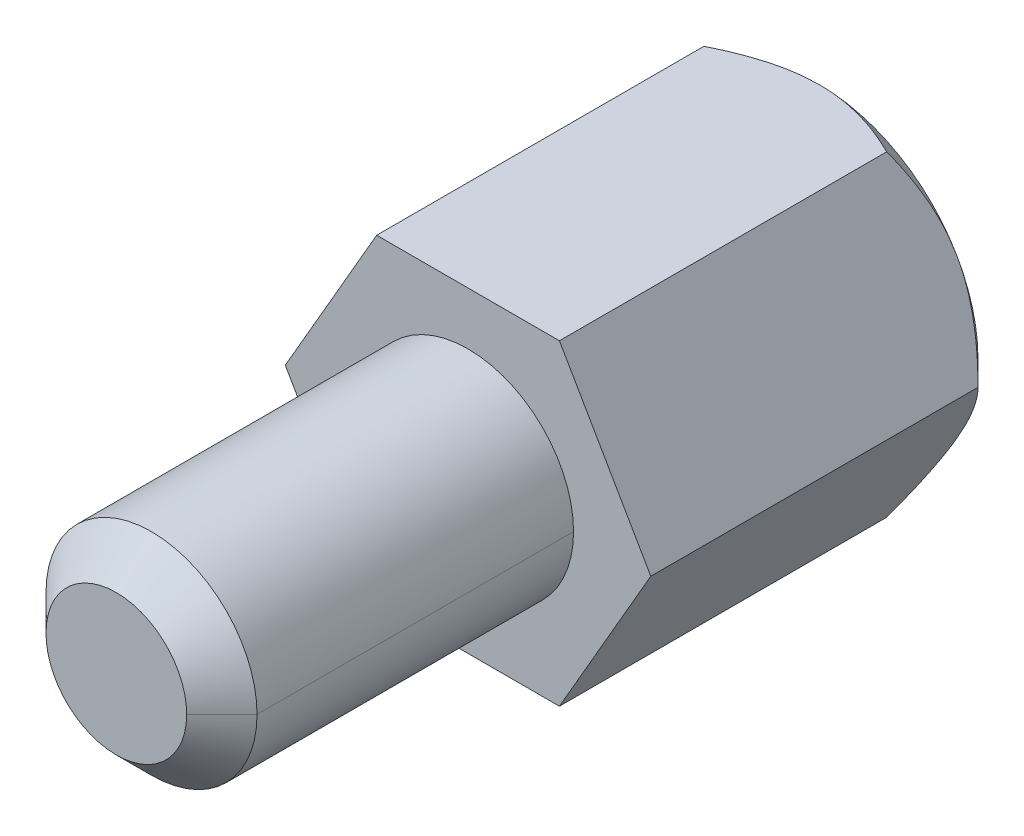
ISO-10303-21;
HEADER;
FILE_DESCRIPTION(('STEP AP214'),'2;1');
FILE_NAME('part.step','',(''),(''),'','','');
FILE_SCHEMA(('AUTOMOTIVE_DESIGN { 1 0 10303 214 1 1 1 1 }'));
ENDSEC;
DATA;
#1=APPLICATION_CONTEXT('core data for automotive mechanical design processes');
#2=APPLICATION_PROTOCOL_DEFINITION('international standard','automotive_design',2000,#1);
#3=PRODUCT_CONTEXT('',#1,'mechanical');
#4=PRODUCT('Part','Part','',(#3));
#5=PRODUCT_RELATED_PRODUCT_CATEGORY('part','',(#4));
#6=PRODUCT_DEFINITION_FORMATION('','',#4);
#7=PRODUCT_DEFINITION_CONTEXT('part definition',#1,'design');
#8=PRODUCT_DEFINITION('design','',#6,#7);
#9=PRODUCT_DEFINITION_SHAPE('','',#8);
#10=(LENGTH_UNIT() NAMED_UNIT(*) SI_UNIT(.MILLI.,.METRE.));
#11=(NAMED_UNIT(*) PLANE_ANGLE_UNIT() SI_UNIT($,.RADIAN.));
#12=(NAMED_UNIT(*) SI_UNIT($,.STERADIAN.) SOLID_ANGLE_UNIT());
#13=UNCERTAINTY_MEASURE_WITH_UNIT(LENGTH_MEASURE(1.E-05),#10,'distance_accuracy_value','');
#14=(GEOMETRIC_REPRESENTATION_CONTEXT(3) GLOBAL_UNCERTAINTY_ASSIGNED_CONTEXT((#13)) GLOBAL_UNIT_ASSIGNED_CONTEXT((#10,
#11,#12)) REPRESENTATION_CONTEXT('',''));
#15=CARTESIAN_POINT('',(0.,0.,0.));
#16=DIRECTION('',(0.,0.,1.));
#17=DIRECTION('',(1.,0.,0.));
#18=AXIS2_PLACEMENT_3D('',#15,#16,#17);
#19=CARTESIAN_POINT('',(0.,0.,-4.5));
#20=DIRECTION('',(0.,0.,-1.));
#21=DIRECTION('',(-1.,0.,0.));
#22=AXIS2_PLACEMENT_3D('',#19,#20,#21);
#23=CONICAL_SURFACE('',#22,1.2,0.78539816339745);
#24=CARTESIAN_POINT('',(0.,0.,-4.5));
#25=DIRECTION('',(0.,0.,-1.));
#26=DIRECTION('',(1.,0.,0.));
#27=AXIS2_PLACEMENT_3D('',#24,#25,#26);
#28=CIRCLE('',#27,1.2);
#29=CARTESIAN_POINT('',(1.2,0.,-4.5));
#30=VERTEX_POINT('',#29);
#31=CARTESIAN_POINT('',(-1.2,0.,-4.5));
#32=VERTEX_POINT('',#31);
#33=EDGE_CURVE('E43',#30,#32,#28,.T.);
#34=ORIENTED_EDGE('',*,*,#33,.F.);
#35=DIRECTION('',(0.707106781186549,0.,-0.707106781186546));
#36=VECTOR('',#35,1.);
#37=CARTESIAN_POINT('',(1.2,0.,-4.5));
#38=LINE('',#37,#36);
#39=CARTESIAN_POINT('',(1.7,0.,-5.));
#40=VERTEX_POINT('',#39);
#41=EDGE_CURVE('E11',#30,#40,#38,.T.);
#42=ORIENTED_EDGE('',*,*,#41,.T.);
#43=CARTESIAN_POINT('',(0.,0.,-5.));
#44=DIRECTION('',(0.,0.,1.));
#45=DIRECTION('',(1.,0.,0.));
#46=AXIS2_PLACEMENT_3D('',#43,#44,#45);
#47=CIRCLE('',#46,1.7);
#48=CARTESIAN_POINT('',(-1.7,0.,-5.));
#49=VERTEX_POINT('',#48);
#50=EDGE_CURVE('E427',#49,#40,#47,.T.);
#51=ORIENTED_EDGE('',*,*,#50,.F.);
#52=DIRECTION('',(-0.707106781186549,0.,-0.707106781186546));
#53=VECTOR('',#52,1.);
#54=CARTESIAN_POINT('',(-1.2,0.,-4.5));
#55=LINE('',#54,#53);
#56=EDGE_CURVE('E437',#32,#49,#55,.T.);
#57=ORIENTED_EDGE('',*,*,#56,.F.);
#58=EDGE_LOOP('',(#34,#42,#51,#57));
#59=FACE_BOUND('',#58,.T.);
#60=ADVANCED_FACE('F16',(#59),#23,.F.);
#61=CARTESIAN_POINT('',(0.,0.,-1.));
#62=DIRECTION('',(0.,0.,-1.));
#63=DIRECTION('',(-1.,0.,0.));
#64=AXIS2_PLACEMENT_3D('',#61,#62,#63);
#65=CYLINDRICAL_SURFACE('',#64,1.2);
#66=CARTESIAN_POINT('',(0.,0.,-1.));
#67=DIRECTION('',(0.,0.,-1.));
#68=DIRECTION('',(-1.,0.,0.));
#69=AXIS2_PLACEMENT_3D('',#66,#67,#68);
#70=CIRCLE('',#69,1.2);
#71=CARTESIAN_POINT('',(1.2,0.,-1.));
#72=VERTEX_POINT('',#71);
#73=CARTESIAN_POINT('',(-1.2,0.,-1.));
#74=VERTEX_POINT('',#73);
#75=EDGE_CURVE('E490',#72,#74,#70,.T.);
#76=ORIENTED_EDGE('',*,*,#75,.F.);
#77=DIRECTION('',(0.,0.,-1.));
#78=VECTOR('',#77,1.);
#79=CARTESIAN_POINT('',(1.2,0.,-1.));
#80=LINE('',#79,#78);
#81=EDGE_CURVE('E29',#72,#30,#80,.T.);
#82=ORIENTED_EDGE('',*,*,#81,.T.);
#83=ORIENTED_EDGE('',*,*,#33,.T.);
#84=DIRECTION('',(0.,0.,-1.));
#85=VECTOR('',#84,1.);
#86=CARTESIAN_POINT('',(-1.2,0.,-1.));
#87=LINE('',#86,#85);
#88=EDGE_CURVE('E484',#74,#32,#87,.T.);
#89=ORIENTED_EDGE('',*,*,#88,.F.);
#90=EDGE_LOOP('',(#76,#82,#83,#89));
#91=FACE_BOUND('',#90,.T.);
#92=ADVANCED_FACE('F18',(#91),#65,.F.);
#93=CARTESIAN_POINT('',(0.,0.,-3.9395963451307));
#94=DIRECTION('',(0.,0.,1.));
#95=DIRECTION('',(1.,0.,0.));
#96=AXIS2_PLACEMENT_3D('',#93,#94,#95);
#97=CONICAL_SURFACE('',#96,3.3104036548693,0.785398163397443);
#98=CARTESIAN_POINT('',(0.,0.,-5.));
#99=DIRECTION('',(0.,0.,-1.));
#100=DIRECTION('',(1.,0.,0.));
#101=AXIS2_PLACEMENT_3D('',#98,#99,#100);
#102=CIRCLE('',#101,2.25);
#103=CARTESIAN_POINT('',(2.25,0.,-5.));
#104=VERTEX_POINT('',#103);
#105=CARTESIAN_POINT('',(1.948557158515,-1.125,-5.));
#106=VERTEX_POINT('',#105);
#107=EDGE_CURVE('E625',#104,#106,#102,.T.);
#108=ORIENTED_EDGE('',*,*,#107,.F.);
#109=DIRECTION('',(0.707106781186544,0.,0.707106781186552));
#110=VECTOR('',#109,1.);
#111=CARTESIAN_POINT('',(3.3104036548693,0.,-3.9395963451307));
#112=LINE('',#111,#110);
#113=CARTESIAN_POINT('',(2.59807621135333,0.,-4.65192378864669));
#114=VERTEX_POINT('',#113);
#115=EDGE_CURVE('E454',#104,#114,#112,.T.);
#116=ORIENTED_EDGE('',*,*,#115,.T.);
#117=CARTESIAN_POINT('',(1.94855715851499,-1.125,-5.));
#118=CARTESIAN_POINT('',(2.11169365571798,-0.842439298275589,-5.));
#119=CARTESIAN_POINT('',(2.28210688404402,-0.547274928533067,-4.90318904093193));
#120=CARTESIAN_POINT('',(2.43191789424751,-0.287794647327387,-4.81808210575311));
#121=CARTESIAN_POINT('',(2.59807621135332,0.,-4.65192378864668));
#122=B_SPLINE_CURVE_WITH_KNOTS('',2,(#117,#118,#119,#120,#121),.UNSPECIFIED.,.F.,.F.,(3,2,3),
(0.,0.5,1.),.UNSPECIFIED.);
#123=EDGE_CURVE('E648',#106,#114,#122,.T.);
#124=ORIENTED_EDGE('',*,*,#123,.F.);
#125=EDGE_LOOP('',(#108,#116,#124));
#126=FACE_BOUND('',#125,.T.);
#127=ADVANCED_FACE('F387',(#126),#97,.T.);
#128=CARTESIAN_POINT('',(0.,0.,5.));
#129=DIRECTION('',(0.,0.,-1.));
#130=DIRECTION('',(-1.,0.,0.));
#131=AXIS2_PLACEMENT_3D('',#128,#129,#130);
#132=CONICAL_SURFACE('',#131,1.,0.785398163397446);
#133=CARTESIAN_POINT('',(0.,0.,5.));
#134=DIRECTION('',(0.,0.,1.));
#135=DIRECTION('',(1.,0.,0.));
#136=AXIS2_PLACEMENT_3D('',#133,#134,#135);
#137=CIRCLE('',#136,1.);
#138=CARTESIAN_POINT('',(1.,0.,5.));
#139=VERTEX_POINT('',#138);
#140=CARTESIAN_POINT('',(-1.,0.,5.));
#141=VERTEX_POINT('',#140);
#142=EDGE_CURVE('E267',#139,#141,#137,.T.);
#143=ORIENTED_EDGE('',*,*,#142,.F.);
#144=DIRECTION('',(0.707106781186546,0.,-0.707106781186549));
#145=VECTOR('',#144,1.);
#146=CARTESIAN_POINT('',(1.,0.,5.));
#147=LINE('',#146,#145);
#148=CARTESIAN_POINT('',(1.5,0.,4.5));
#149=VERTEX_POINT('',#148);
#150=EDGE_CURVE('E450',#139,#149,#147,.T.);
#151=ORIENTED_EDGE('',*,*,#150,.T.);
#152=CARTESIAN_POINT('',(0.,0.,4.5));
#153=DIRECTION('',(0.,0.,-1.));
#154=DIRECTION('',(1.,0.,0.));
#155=AXIS2_PLACEMENT_3D('',#152,#153,#154);
#156=CIRCLE('',#155,1.5);
#157=CARTESIAN_POINT('',(-1.5,0.,4.5));
#158=VERTEX_POINT('',#157);
#159=EDGE_CURVE('E455',#158,#149,#156,.T.);
#160=ORIENTED_EDGE('',*,*,#159,.F.);
#161=DIRECTION('',(-0.707106781186546,0.,-0.707106781186549));
#162=VECTOR('',#161,1.);
#163=CARTESIAN_POINT('',(-1.,0.,5.));
#164=LINE('',#163,#162);
#165=EDGE_CURVE('E261',#141,#158,#164,.T.);
#166=ORIENTED_EDGE('',*,*,#165,.F.);
#167=EDGE_LOOP('',(#143,#151,#160,#166));
#168=FACE_BOUND('',#167,.T.);
#169=ADVANCED_FACE('F397',(#168),#132,.T.);
#170=CARTESIAN_POINT('',(0.,0.,5.));
#171=DIRECTION('',(0.,0.,-1.));
#172=DIRECTION('',(-1.,0.,0.));
#173=AXIS2_PLACEMENT_3D('',#170,#171,#172);
#174=CYLINDRICAL_SURFACE('',#173,1.5);
#175=ORIENTED_EDGE('',*,*,#159,.T.);
#176=DIRECTION('',(0.,0.,-1.));
#177=VECTOR('',#176,1.);
#178=CARTESIAN_POINT('',(1.5,0.,5.));
#179=LINE('',#178,#177);
#180=CARTESIAN_POINT('',(1.5,0.,0.));
#181=VERTEX_POINT('',#180);
#182=EDGE_CURVE('E460',#149,#181,#179,.T.);
#183=ORIENTED_EDGE('',*,*,#182,.T.);
#184=CARTESIAN_POINT('',(0.,0.,0.));
#185=DIRECTION('',(0.,0.,1.));
#186=DIRECTION('',(1.,0.,0.));
#187=AXIS2_PLACEMENT_3D('',#184,#185,#186);
#188=CIRCLE('',#187,1.5);
#189=CARTESIAN_POINT('',(-1.5,0.,0.));
#190=VERTEX_POINT('',#189);
#191=EDGE_CURVE('E464',#181,#190,#188,.T.);
#192=ORIENTED_EDGE('',*,*,#191,.T.);
#193=DIRECTION('',(0.,0.,-1.));
#194=VECTOR('',#193,1.);
#195=CARTESIAN_POINT('',(-1.5,0.,5.));
#196=LINE('',#195,#194);
#197=EDGE_CURVE('E497',#158,#190,#196,.T.);
#198=ORIENTED_EDGE('',*,*,#197,.F.);
#199=EDGE_LOOP('',(#175,#183,#192,#198));
#200=FACE_BOUND('',#199,.T.);
#201=ADVANCED_FACE('F244',(#200),#174,.T.);
#202=CARTESIAN_POINT('',(0.,0.,5.));
#203=DIRECTION('',(0.,0.,-1.));
#204=DIRECTION('',(-1.,0.,0.));
#205=AXIS2_PLACEMENT_3D('',#202,#203,#204);
#206=CYLINDRICAL_SURFACE('',#205,1.5);
#207=ORIENTED_EDGE('',*,*,#182,.F.);
#208=CARTESIAN_POINT('',(0.,0.,4.5));
#209=DIRECTION('',(0.,0.,-1.));
#210=DIRECTION('',(1.,0.,0.));
#211=AXIS2_PLACEMENT_3D('',#208,#209,#210);
#212=CIRCLE('',#211,1.5);
#213=EDGE_CURVE('E444',#149,#158,#212,.T.);
#214=ORIENTED_EDGE('',*,*,#213,.T.);
#215=ORIENTED_EDGE('',*,*,#197,.T.);
#216=CARTESIAN_POINT('',(0.,0.,0.));
#217=DIRECTION('',(0.,0.,1.));
#218=DIRECTION('',(1.,0.,0.));
#219=AXIS2_PLACEMENT_3D('',#216,#217,#218);
#220=CIRCLE('',#219,1.5);
#221=EDGE_CURVE('E459',#190,#181,#220,.T.);
#222=ORIENTED_EDGE('',*,*,#221,.T.);
#223=EDGE_LOOP('',(#207,#214,#215,#222));
#224=FACE_BOUND('',#223,.T.);
#225=ADVANCED_FACE('F402',(#224),#206,.T.);
#226=CARTESIAN_POINT('',(0.,0.,5.));
#227=DIRECTION('',(0.,0.,1.));
#228=DIRECTION('',(1.,0.,0.));
#229=AXIS2_PLACEMENT_3D('',#226,#227,#228);
#230=PLANE('',#229);
#231=CARTESIAN_POINT('',(0.,0.,5.));
#232=DIRECTION('',(0.,0.,1.));
#233=DIRECTION('',(1.,0.,0.));
#234=AXIS2_PLACEMENT_3D('',#231,#232,#233);
#235=CIRCLE('',#234,1.);
#236=EDGE_CURVE('E456',#141,#139,#235,.T.);
#237=ORIENTED_EDGE('',*,*,#236,.T.);
#238=ORIENTED_EDGE('',*,*,#142,.T.);
#239=EDGE_LOOP('',(#237,#238));
#240=FACE_BOUND('',#239,.T.);
#241=ADVANCED_FACE('F399',(#240),#230,.T.);
#242=CARTESIAN_POINT('',(0.,0.,5.));
#243=DIRECTION('',(0.,0.,-1.));
#244=DIRECTION('',(-1.,0.,0.));
#245=AXIS2_PLACEMENT_3D('',#242,#243,#244);
#246=CONICAL_SURFACE('',#245,1.,0.785398163397446);
#247=ORIENTED_EDGE('',*,*,#150,.F.);
#248=ORIENTED_EDGE('',*,*,#236,.F.);
#249=ORIENTED_EDGE('',*,*,#165,.T.);
#250=ORIENTED_EDGE('',*,*,#213,.F.);
#251=EDGE_LOOP('',(#247,#248,#249,#250));
#252=FACE_BOUND('',#251,.T.);
#253=ADVANCED_FACE('F302',(#252),#246,.T.);
#254=CARTESIAN_POINT('',(-1.29903810567666,-2.25,0.));
#255=DIRECTION('',(0.,0.,1.));
#256=DIRECTION('',(1.,0.,0.));
#257=AXIS2_PLACEMENT_3D('',#254,#255,#256);
#258=PLANE('',#257);
#259=DIRECTION('',(-0.5,0.866025403784439,0.));
#260=VECTOR('',#259,1.);
#261=CARTESIAN_POINT('',(-1.29903810567666,-2.25,0.));
#262=LINE('',#261,#260);
#263=CARTESIAN_POINT('',(-1.29903810567666,-2.25,0.));
#264=VERTEX_POINT('',#263);
#265=CARTESIAN_POINT('',(-2.59807621135332,0.,0.));
#266=VERTEX_POINT('',#265);
#267=EDGE_CURVE('E168',#264,#266,#262,.T.);
#268=ORIENTED_EDGE('',*,*,#267,.F.);
#269=DIRECTION('',(-1.,0.,0.));
#270=VECTOR('',#269,1.);
#271=CARTESIAN_POINT('',(1.29903810567666,-2.25,0.));
#272=LINE('',#271,#270);
#273=CARTESIAN_POINT('',(1.29903810567666,-2.25,0.));
#274=VERTEX_POINT('',#273);
#275=EDGE_CURVE('E471',#274,#264,#272,.T.);
#276=ORIENTED_EDGE('',*,*,#275,.F.);
#277=DIRECTION('',(-0.5,-0.866025403784439,0.));
#278=VECTOR('',#277,1.);
#279=CARTESIAN_POINT('',(2.59807621135332,0.,0.));
#280=LINE('',#279,#278);
#281=CARTESIAN_POINT('',(2.59807621135332,0.,0.));
#282=VERTEX_POINT('',#281);
#283=EDGE_CURVE('E446',#282,#274,#280,.T.);
#284=ORIENTED_EDGE('',*,*,#283,.F.);
#285=DIRECTION('',(0.5,-0.866025403784439,0.));
#286=VECTOR('',#285,1.);
#287=CARTESIAN_POINT('',(1.29903810567666,2.25,0.));
#288=LINE('',#287,#286);
#289=CARTESIAN_POINT('',(1.29903810567666,2.25,0.));
#290=VERTEX_POINT('',#289);
#291=EDGE_CURVE('E465',#290,#282,#288,.T.);
#292=ORIENTED_EDGE('',*,*,#291,.F.);
#293=DIRECTION('',(1.,0.,0.));
#294=VECTOR('',#293,1.);
#295=CARTESIAN_POINT('',(-1.29903810567665,2.25,0.));
#296=LINE('',#295,#294);
#297=CARTESIAN_POINT('',(-1.29903810567665,2.25,0.));
#298=VERTEX_POINT('',#297);
#299=EDGE_CURVE('E171',#298,#290,#296,.T.);
#300=ORIENTED_EDGE('',*,*,#299,.F.);
#301=DIRECTION('',(0.5,0.866025403784439,0.));
#302=VECTOR('',#301,1.);
#303=CARTESIAN_POINT('',(-2.59807621135332,0.,0.));
#304=LINE('',#303,#302);
#305=EDGE_CURVE('E164',#266,#298,#304,.T.);
#306=ORIENTED_EDGE('',*,*,#305,.F.);
#307=EDGE_LOOP('',(#268,#276,#284,#292,#300,#306));
#308=FACE_BOUND('',#307,.T.);
#309=ORIENTED_EDGE('',*,*,#221,.F.);
#310=ORIENTED_EDGE('',*,*,#191,.F.);
#311=EDGE_LOOP('',(#309,#310));
#312=FACE_BOUND('',#311,.T.);
#313=ADVANCED_FACE('F166',(#308,#312),#258,.T.);
#314=CARTESIAN_POINT('',(-1.29903810567665,-2.25,-5.));
#315=DIRECTION('',(0.866025403784439,0.5,0.));
#316=DIRECTION('',(0.,0.,-1.));
#317=AXIS2_PLACEMENT_3D('',#314,#315,#316);
#318=PLANE('',#317);
#319=DIRECTION('',(0.,0.,1.));
#320=VECTOR('',#319,1.);
#321=CARTESIAN_POINT('',(-2.59807621135332,0.,-5.));
#322=LINE('',#321,#320);
#323=CARTESIAN_POINT('',(-2.5980762113533,0.,-4.65192378864668));
#324=VERTEX_POINT('',#323);
#325=EDGE_CURVE('E176',#324,#266,#322,.T.);
#326=ORIENTED_EDGE('',*,*,#325,.F.);
#327=CARTESIAN_POINT('',(-2.59807621135331,0.,-4.65192378864668));
#328=CARTESIAN_POINT('',(-2.43332011776567,-0.285365924950353,-4.81667988223433));
#329=CARTESIAN_POINT('',(-2.28416109301223,-0.543716934230743,-4.90201788690797));
#330=CARTESIAN_POINT('',(-2.11290191618965,-0.840346529749865,-5.));
#331=CARTESIAN_POINT('',(-1.94855715851498,-1.125,-5.));
#332=B_SPLINE_CURVE_WITH_KNOTS('',2,(#327,#328,#329,#330,#331),.UNSPECIFIED.,.F.,.F.,(3,2,3),
(0.,0.5,1.),.UNSPECIFIED.);
#333=CARTESIAN_POINT('',(-1.94855715851499,-1.125,-5.));
#334=VERTEX_POINT('',#333);
#335=EDGE_CURVE('E257',#324,#334,#332,.T.);
#336=ORIENTED_EDGE('',*,*,#335,.T.);
#337=CARTESIAN_POINT('',(-1.94855715851498,-1.125,-5.));
#338=CARTESIAN_POINT('',(-1.78542066131107,-1.407560701726,-5.));
#339=CARTESIAN_POINT('',(-1.61500743298595,-1.70272507146693,-4.90318904093194));
#340=CARTESIAN_POINT('',(-1.4651964227814,-1.96220535267443,-4.81808210575207));
#341=CARTESIAN_POINT('',(-1.29903810567665,-2.25,-4.65192378864668));
#342=B_SPLINE_CURVE_WITH_KNOTS('',2,(#337,#338,#339,#340,#341),.UNSPECIFIED.,.F.,.F.,(3,2,3),
(0.,0.5,1.),.UNSPECIFIED.);
#343=CARTESIAN_POINT('',(-1.29903810567665,-2.25,-4.65192378864668));
#344=VERTEX_POINT('',#343);
#345=EDGE_CURVE('E225',#334,#344,#342,.T.);
#346=ORIENTED_EDGE('',*,*,#345,.T.);
#347=DIRECTION('',(0.,0.,1.));
#348=VECTOR('',#347,1.);
#349=CARTESIAN_POINT('',(-1.29903810567665,-2.25,-5.));
#350=LINE('',#349,#348);
#351=EDGE_CURVE('E184',#344,#264,#350,.T.);
#352=ORIENTED_EDGE('',*,*,#351,.T.);
#353=ORIENTED_EDGE('',*,*,#267,.T.);
#354=EDGE_LOOP('',(#326,#336,#346,#352,#353));
#355=FACE_BOUND('',#354,.T.);
#356=ADVANCED_FACE('F180',(#355),#318,.F.);
#357=CARTESIAN_POINT('',(-2.59807621135332,0.,-5.));
#358=DIRECTION('',(0.866025403784439,-0.5,0.));
#359=DIRECTION('',(0.,0.,-1.));
#360=AXIS2_PLACEMENT_3D('',#357,#358,#359);
#361=PLANE('',#360);
#362=DIRECTION('',(0.,0.,1.));
#363=VECTOR('',#362,1.);
#364=CARTESIAN_POINT('',(-1.29903810567665,2.25,-5.));
#365=LINE('',#364,#363);
#366=CARTESIAN_POINT('',(-1.29903810567665,2.25,-4.65192378864668));
#367=VERTEX_POINT('',#366);
#368=EDGE_CURVE('E504',#367,#298,#365,.T.);
#369=ORIENTED_EDGE('',*,*,#368,.F.);
#370=CARTESIAN_POINT('',(-1.29903810567666,2.25,-4.65192378864668));
#371=CARTESIAN_POINT('',(-1.46379419926481,1.96463407504874,-4.81667988223484));
#372=CARTESIAN_POINT('',(-1.61295322401773,1.70628306576926,-4.90201788690796));
#373=CARTESIAN_POINT('',(-1.78421240084075,1.40965347024936,-5.));
#374=CARTESIAN_POINT('',(-1.94855715851499,1.125,-5.));
#375=B_SPLINE_CURVE_WITH_KNOTS('',2,(#370,#371,#372,#373,#374),.UNSPECIFIED.,.F.,.F.,(3,2,3),
(0.,0.5,1.),.UNSPECIFIED.);
#376=CARTESIAN_POINT('',(-1.94855715851499,1.125,-5.));
#377=VERTEX_POINT('',#376);
#378=EDGE_CURVE('E186',#367,#377,#375,.T.);
#379=ORIENTED_EDGE('',*,*,#378,.T.);
#380=CARTESIAN_POINT('',(-1.94855715851499,1.125,-5.));
#381=CARTESIAN_POINT('',(-2.11169365571896,0.842439298273893,-5.));
#382=CARTESIAN_POINT('',(-2.28210688404401,0.547274928533074,-4.90318904093194));
#383=CARTESIAN_POINT('',(-2.43191789424865,0.287794647325415,-4.81808210575199));
#384=CARTESIAN_POINT('',(-2.59807621135331,0.,-4.65192378864668));
#385=B_SPLINE_CURVE_WITH_KNOTS('',2,(#380,#381,#382,#383,#384),.UNSPECIFIED.,.F.,.F.,(3,2,3),
(0.,0.5,1.),.UNSPECIFIED.);
#386=EDGE_CURVE('E192',#377,#324,#385,.T.);
#387=ORIENTED_EDGE('',*,*,#386,.T.);
#388=ORIENTED_EDGE('',*,*,#325,.T.);
#389=ORIENTED_EDGE('',*,*,#305,.T.);
#390=EDGE_LOOP('',(#369,#379,#387,#388,#389));
#391=FACE_BOUND('',#390,.T.);
#392=ADVANCED_FACE('F189',(#391),#361,.F.);
#393=CARTESIAN_POINT('',(-1.29903810567665,2.25,-5.));
#394=DIRECTION('',(0.,-1.,0.));
#395=DIRECTION('',(0.,0.,-1.));
#396=AXIS2_PLACEMENT_3D('',#393,#394,#395);
#397=PLANE('',#396);
#398=DIRECTION('',(0.,0.,1.));
#399=VECTOR('',#398,1.);
#400=CARTESIAN_POINT('',(1.29903810567666,2.25,-5.));
#401=LINE('',#400,#399);
#402=CARTESIAN_POINT('',(1.29903810567666,2.25,-4.65192378864669));
#403=VERTEX_POINT('',#402);
#404=EDGE_CURVE('E469',#403,#290,#401,.T.);
#405=ORIENTED_EDGE('',*,*,#404,.F.);
#406=CARTESIAN_POINT('',(1.29903810567667,2.25,-4.65192378864669));
#407=CARTESIAN_POINT('',(0.96806314563542,2.25,-4.81741126866729));
#408=CARTESIAN_POINT('',(0.66850190249739,2.25,-4.90278999796724));
#409=CARTESIAN_POINT('',(0.32742925720091,2.25,-5.));
#410=CARTESIAN_POINT('',(0.,2.25,-5.));
#411=B_SPLINE_CURVE_WITH_KNOTS('',2,(#406,#407,#408,#409,#410),.UNSPECIFIED.,.F.,.F.,(3,2,3),
(0.,0.5,1.),.UNSPECIFIED.);
#412=CARTESIAN_POINT('',(0.,2.25,-5.));
#413=VERTEX_POINT('',#412);
#414=EDGE_CURVE('E177',#403,#413,#411,.T.);
#415=ORIENTED_EDGE('',*,*,#414,.T.);
#416=CARTESIAN_POINT('',(0.,2.25,-5.));
#417=CARTESIAN_POINT('',(-0.327135265220307,2.25,-5.));
#418=CARTESIAN_POINT('',(-0.66893435586008,2.25,-4.90266679560614));
#419=CARTESIAN_POINT('',(-0.967721984934793,2.25,-4.81758184901763));
#420=CARTESIAN_POINT('',(-1.29903810567665,2.25,-4.65192378864668));
#421=B_SPLINE_CURVE_WITH_KNOTS('',2,(#416,#417,#418,#419,#420),.UNSPECIFIED.,.F.,.F.,(3,2,3),
(0.,0.5,1.),.UNSPECIFIED.);
#422=EDGE_CURVE('E511',#413,#367,#421,.T.);
#423=ORIENTED_EDGE('',*,*,#422,.T.);
#424=ORIENTED_EDGE('',*,*,#368,.T.);
#425=ORIENTED_EDGE('',*,*,#299,.T.);
#426=EDGE_LOOP('',(#405,#415,#423,#424,#425));
#427=FACE_BOUND('',#426,.T.);
#428=ADVANCED_FACE('F301',(#427),#397,.F.);
#429=CARTESIAN_POINT('',(1.29903810567666,2.25,-5.));
#430=DIRECTION('',(-0.866025403784439,-0.5,0.));
#431=DIRECTION('',(-0.5,0.866025403784439,0.));
#432=AXIS2_PLACEMENT_3D('',#429,#430,#431);
#433=PLANE('',#432);
#434=DIRECTION('',(0.,0.,1.));
#435=VECTOR('',#434,1.);
#436=CARTESIAN_POINT('',(2.59807621135332,0.,-5.));
#437=LINE('',#436,#435);
#438=EDGE_CURVE('E449',#114,#282,#437,.T.);
#439=ORIENTED_EDGE('',*,*,#438,.F.);
#440=CARTESIAN_POINT('',(2.59807621135332,0.,-4.65192378864668));
#441=CARTESIAN_POINT('',(2.43332011776683,0.285365924948369,-4.81667988223315));
#442=CARTESIAN_POINT('',(2.28416109301224,0.543716934230743,-4.90201788690795));
#443=CARTESIAN_POINT('',(2.11290191619064,0.840346529748177,-5.));
#444=CARTESIAN_POINT('',(1.94855715851499,1.125,-5.));
#445=B_SPLINE_CURVE_WITH_KNOTS('',2,(#440,#441,#442,#443,#444),.UNSPECIFIED.,.F.,.F.,(3,2,3),
(0.,0.5,1.),.UNSPECIFIED.);
#446=CARTESIAN_POINT('',(1.948557158515,1.125,-5.));
#447=VERTEX_POINT('',#446);
#448=EDGE_CURVE('E505',#114,#447,#445,.T.);
#449=ORIENTED_EDGE('',*,*,#448,.T.);
#450=CARTESIAN_POINT('',(1.94855715851499,1.125,-5.));
#451=CARTESIAN_POINT('',(1.78542066131202,1.40756070172436,-5.));
#452=CARTESIAN_POINT('',(1.61500743298597,1.70272507146693,-4.90318904093193));
#453=CARTESIAN_POINT('',(1.46519642278249,1.96220535267256,-4.81808210575313));
#454=CARTESIAN_POINT('',(1.29903810567666,2.25,-4.65192378864668));
#455=B_SPLINE_CURVE_WITH_KNOTS('',2,(#450,#451,#452,#453,#454),.UNSPECIFIED.,.F.,.F.,(3,2,3),
(0.,0.5,1.),.UNSPECIFIED.);
#456=EDGE_CURVE('E515',#447,#403,#455,.T.);
#457=ORIENTED_EDGE('',*,*,#456,.T.);
#458=ORIENTED_EDGE('',*,*,#404,.T.);
#459=ORIENTED_EDGE('',*,*,#291,.T.);
#460=EDGE_LOOP('',(#439,#449,#457,#458,#459));
#461=FACE_BOUND('',#460,.T.);
#462=ADVANCED_FACE('F565',(#461),#433,.F.);
#463=CARTESIAN_POINT('',(2.59807621135332,0.,-5.));
#464=DIRECTION('',(-0.866025403784439,0.5,0.));
#465=DIRECTION('',(0.,0.,1.));
#466=AXIS2_PLACEMENT_3D('',#463,#464,#465);
#467=PLANE('',#466);
#468=DIRECTION('',(0.,0.,1.));
#469=VECTOR('',#468,1.);
#470=CARTESIAN_POINT('',(1.29903810567666,-2.25,-5.));
#471=LINE('',#470,#469);
#472=CARTESIAN_POINT('',(1.29903810567666,-2.25,-4.65192378864669));
#473=VERTEX_POINT('',#472);
#474=EDGE_CURVE('E474',#473,#274,#471,.T.);
#475=ORIENTED_EDGE('',*,*,#474,.F.);
#476=CARTESIAN_POINT('',(1.29903810567666,-2.25,-4.65192378864668));
#477=CARTESIAN_POINT('',(1.46379419926432,-1.9646340750496,-4.81667988223433));
#478=CARTESIAN_POINT('',(1.61295322401774,-1.70628306576925,-4.90201788690796));
#479=CARTESIAN_POINT('',(1.78421240084034,-1.40965347025009,-5.));
#480=CARTESIAN_POINT('',(1.94855715851499,-1.125,-5.));
#481=B_SPLINE_CURVE_WITH_KNOTS('',2,(#476,#477,#478,#479,#480),.UNSPECIFIED.,.F.,.F.,(3,2,3),
(0.,0.5,1.),.UNSPECIFIED.);
#482=EDGE_CURVE('E470',#473,#106,#481,.T.);
#483=ORIENTED_EDGE('',*,*,#482,.T.);
#484=ORIENTED_EDGE('',*,*,#123,.T.);
#485=ORIENTED_EDGE('',*,*,#438,.T.);
#486=ORIENTED_EDGE('',*,*,#283,.T.);
#487=EDGE_LOOP('',(#475,#483,#484,#485,#486));
#488=FACE_BOUND('',#487,.T.);
#489=ADVANCED_FACE('F368',(#488),#467,.F.);
#490=CARTESIAN_POINT('',(1.29903810567666,-2.25,-5.));
#491=DIRECTION('',(0.,1.,0.));
#492=DIRECTION('',(1.,0.,0.));
#493=AXIS2_PLACEMENT_3D('',#490,#491,#492);
#494=PLANE('',#493);
#495=ORIENTED_EDGE('',*,*,#351,.F.);
#496=CARTESIAN_POINT('',(-1.29903810567665,-2.25,-4.65192378864667));
#497=CARTESIAN_POINT('',(-0.968298108522936,-2.25,-4.81729378722356));
#498=CARTESIAN_POINT('',(-0.668934355860116,-2.25,-4.90266679560612));
#499=CARTESIAN_POINT('',(-0.327631713747806,-2.25,-4.99999999999999));
#500=CARTESIAN_POINT('',(0.,-2.25,-4.99999999999999));
#501=B_SPLINE_CURVE_WITH_KNOTS('',2,(#496,#497,#498,#499,#500),.UNSPECIFIED.,.F.,.F.,(3,2,3),
(0.,0.5,1.),.UNSPECIFIED.);
#502=CARTESIAN_POINT('',(0.,-2.25,-5.));
#503=VERTEX_POINT('',#502);
#504=EDGE_CURVE('E379',#344,#503,#501,.T.);
#505=ORIENTED_EDGE('',*,*,#504,.T.);
#506=CARTESIAN_POINT('',(0.,-2.25,-4.99999999999999));
#507=CARTESIAN_POINT('',(0.326934914521115,-2.25,-4.99999999999999));
#508=CARTESIAN_POINT('',(0.668501902497399,-2.25,-4.90278999796723));
#509=CARTESIAN_POINT('',(0.967489483182874,-2.25,-4.81769809989357));
#510=CARTESIAN_POINT('',(1.29903810567666,-2.25,-4.65192378864668));
#511=B_SPLINE_CURVE_WITH_KNOTS('',2,(#506,#507,#508,#509,#510),.UNSPECIFIED.,.F.,.F.,(3,2,3),
(0.,0.5,1.),.UNSPECIFIED.);
#512=EDGE_CURVE('E357',#503,#473,#511,.T.);
#513=ORIENTED_EDGE('',*,*,#512,.T.);
#514=ORIENTED_EDGE('',*,*,#474,.T.);
#515=ORIENTED_EDGE('',*,*,#275,.T.);
#516=EDGE_LOOP('',(#495,#505,#513,#514,#515));
#517=FACE_BOUND('',#516,.T.);
#518=ADVANCED_FACE('F360',(#517),#494,.F.);
#519=CARTESIAN_POINT('',(0.,0.,-3.9395963451307));
#520=DIRECTION('',(0.,0.,1.));
#521=DIRECTION('',(1.,0.,0.));
#522=AXIS2_PLACEMENT_3D('',#519,#520,#521);
#523=CONICAL_SURFACE('',#522,3.3104036548693,0.785398163397443);
#524=ORIENTED_EDGE('',*,*,#115,.F.);
#525=CARTESIAN_POINT('',(0.,0.,-5.));
#526=DIRECTION('',(0.,0.,-1.));
#527=DIRECTION('',(1.,0.,0.));
#528=AXIS2_PLACEMENT_3D('',#525,#526,#527);
#529=CIRCLE('',#528,2.25);
#530=EDGE_CURVE('E425',#447,#104,#529,.T.);
#531=ORIENTED_EDGE('',*,*,#530,.F.);
#532=ORIENTED_EDGE('',*,*,#448,.F.);
#533=EDGE_LOOP('',(#524,#531,#532));
#534=FACE_BOUND('',#533,.T.);
#535=ADVANCED_FACE('F304',(#534),#523,.T.);
#536=CARTESIAN_POINT('',(0.,0.,-3.9395963451307));
#537=DIRECTION('',(0.,0.,1.));
#538=DIRECTION('',(1.,0.,0.));
#539=AXIS2_PLACEMENT_3D('',#536,#537,#538);
#540=CONICAL_SURFACE('',#539,3.3104036548693,0.785398163397443);
#541=ORIENTED_EDGE('',*,*,#456,.F.);
#542=CARTESIAN_POINT('',(0.,0.,-5.));
#543=DIRECTION('',(0.,0.,-1.));
#544=DIRECTION('',(1.,0.,0.));
#545=AXIS2_PLACEMENT_3D('',#542,#543,#544);
#546=CIRCLE('',#545,2.25);
#547=EDGE_CURVE('E432',#413,#447,#546,.T.);
#548=ORIENTED_EDGE('',*,*,#547,.F.);
#549=ORIENTED_EDGE('',*,*,#414,.F.);
#550=EDGE_LOOP('',(#541,#548,#549));
#551=FACE_BOUND('',#550,.T.);
#552=ADVANCED_FACE('F594',(#551),#540,.T.);
#553=CARTESIAN_POINT('',(0.,0.,-3.9395963451307));
#554=DIRECTION('',(0.,0.,1.));
#555=DIRECTION('',(1.,0.,0.));
#556=AXIS2_PLACEMENT_3D('',#553,#554,#555);
#557=CONICAL_SURFACE('',#556,3.3104036548693,0.785398163397443);
#558=CARTESIAN_POINT('',(0.,0.,-5.));
#559=DIRECTION('',(0.,0.,-1.));
#560=DIRECTION('',(-1.,0.,0.));
#561=AXIS2_PLACEMENT_3D('',#558,#559,#560);
#562=CIRCLE('',#561,2.25);
#563=EDGE_CURVE('E214',#377,#413,#562,.T.);
#564=ORIENTED_EDGE('',*,*,#563,.F.);
#565=ORIENTED_EDGE('',*,*,#378,.F.);
#566=ORIENTED_EDGE('',*,*,#422,.F.);
#567=EDGE_LOOP('',(#564,#565,#566));
#568=FACE_BOUND('',#567,.T.);
#569=ADVANCED_FACE('F241',(#568),#557,.T.);
#570=CARTESIAN_POINT('',(0.,0.,-3.9395963451307));
#571=DIRECTION('',(0.,0.,1.));
#572=DIRECTION('',(1.,0.,0.));
#573=AXIS2_PLACEMENT_3D('',#570,#571,#572);
#574=CONICAL_SURFACE('',#573,3.3104036548693,0.785398163397443);
#575=CARTESIAN_POINT('',(0.,0.,-5.));
#576=DIRECTION('',(0.,0.,-1.));
#577=DIRECTION('',(1.,0.,0.));
#578=AXIS2_PLACEMENT_3D('',#575,#576,#577);
#579=CIRCLE('',#578,2.25);
#580=EDGE_CURVE('E209',#334,#377,#579,.T.);
#581=ORIENTED_EDGE('',*,*,#580,.F.);
#582=ORIENTED_EDGE('',*,*,#335,.F.);
#583=ORIENTED_EDGE('',*,*,#386,.F.);
#584=EDGE_LOOP('',(#581,#582,#583));
#585=FACE_BOUND('',#584,.T.);
#586=ADVANCED_FACE('F258',(#585),#574,.T.);
#587=CARTESIAN_POINT('',(0.,0.,-3.9395963451307));
#588=DIRECTION('',(0.,0.,1.));
#589=DIRECTION('',(1.,0.,0.));
#590=AXIS2_PLACEMENT_3D('',#587,#588,#589);
#591=CONICAL_SURFACE('',#590,3.3104036548693,0.785398163397443);
#592=CARTESIAN_POINT('',(0.,0.,-5.));
#593=DIRECTION('',(0.,0.,-1.));
#594=DIRECTION('',(1.,0.,0.));
#595=AXIS2_PLACEMENT_3D('',#592,#593,#594);
#596=CIRCLE('',#595,2.25);
#597=EDGE_CURVE('E213',#503,#334,#596,.T.);
#598=ORIENTED_EDGE('',*,*,#597,.F.);
#599=ORIENTED_EDGE('',*,*,#504,.F.);
#600=ORIENTED_EDGE('',*,*,#345,.F.);
#601=EDGE_LOOP('',(#598,#599,#600));
#602=FACE_BOUND('',#601,.T.);
#603=ADVANCED_FACE('F330',(#602),#591,.T.);
#604=CARTESIAN_POINT('',(0.,0.,-3.9395963451307));
#605=DIRECTION('',(0.,0.,1.));
#606=DIRECTION('',(1.,0.,0.));
#607=AXIS2_PLACEMENT_3D('',#604,#605,#606);
#608=CONICAL_SURFACE('',#607,3.3104036548693,0.785398163397443);
#609=ORIENTED_EDGE('',*,*,#512,.F.);
#610=CARTESIAN_POINT('',(0.,0.,-5.));
#611=DIRECTION('',(0.,0.,-1.));
#612=DIRECTION('',(1.,0.,0.));
#613=AXIS2_PLACEMENT_3D('',#610,#611,#612);
#614=CIRCLE('',#613,2.25);
#615=EDGE_CURVE('E220',#106,#503,#614,.T.);
#616=ORIENTED_EDGE('',*,*,#615,.F.);
#617=ORIENTED_EDGE('',*,*,#482,.F.);
#618=EDGE_LOOP('',(#609,#616,#617));
#619=FACE_BOUND('',#618,.T.);
#620=ADVANCED_FACE('F335',(#619),#608,.T.);
#621=CARTESIAN_POINT('',(0.,0.,-1.));
#622=DIRECTION('',(0.,0.,-1.));
#623=DIRECTION('',(0.,-1.,0.));
#624=AXIS2_PLACEMENT_3D('',#621,#622,#623);
#625=PLANE('',#624);
#626=CARTESIAN_POINT('',(0.,0.,-1.));
#627=DIRECTION('',(0.,0.,-1.));
#628=DIRECTION('',(-1.,0.,0.));
#629=AXIS2_PLACEMENT_3D('',#626,#627,#628);
#630=CIRCLE('',#629,1.2);
#631=EDGE_CURVE('E475',#74,#72,#630,.T.);
#632=ORIENTED_EDGE('',*,*,#631,.T.);
#633=ORIENTED_EDGE('',*,*,#75,.T.);
#634=EDGE_LOOP('',(#632,#633));
#635=FACE_BOUND('',#634,.T.);
#636=ADVANCED_FACE('F412',(#635),#625,.T.);
#637=CARTESIAN_POINT('',(0.,0.,-1.));
#638=DIRECTION('',(0.,0.,-1.));
#639=DIRECTION('',(-1.,0.,0.));
#640=AXIS2_PLACEMENT_3D('',#637,#638,#639);
#641=CYLINDRICAL_SURFACE('',#640,1.2);
#642=ORIENTED_EDGE('',*,*,#81,.F.);
#643=ORIENTED_EDGE('',*,*,#631,.F.);
#644=ORIENTED_EDGE('',*,*,#88,.T.);
#645=CARTESIAN_POINT('',(0.,0.,-4.5));
#646=DIRECTION('',(0.,0.,-1.));
#647=DIRECTION('',(1.,0.,0.));
#648=AXIS2_PLACEMENT_3D('',#645,#646,#647);
#649=CIRCLE('',#648,1.2);
#650=EDGE_CURVE('E481',#32,#30,#649,.T.);
#651=ORIENTED_EDGE('',*,*,#650,.T.);
#652=EDGE_LOOP('',(#642,#643,#644,#651));
#653=FACE_BOUND('',#652,.T.);
#654=ADVANCED_FACE('F408',(#653),#641,.F.);
#655=CARTESIAN_POINT('',(0.,0.,-4.5));
#656=DIRECTION('',(0.,0.,-1.));
#657=DIRECTION('',(-1.,0.,0.));
#658=AXIS2_PLACEMENT_3D('',#655,#656,#657);
#659=CONICAL_SURFACE('',#658,1.2,0.78539816339745);
#660=ORIENTED_EDGE('',*,*,#41,.F.);
#661=ORIENTED_EDGE('',*,*,#650,.F.);
#662=ORIENTED_EDGE('',*,*,#56,.T.);
#663=CARTESIAN_POINT('',(0.,0.,-5.));
#664=DIRECTION('',(0.,0.,1.));
#665=DIRECTION('',(1.,0.,0.));
#666=AXIS2_PLACEMENT_3D('',#663,#664,#665);
#667=CIRCLE('',#666,1.7);
#668=EDGE_CURVE('E429',#40,#49,#667,.T.);
#669=ORIENTED_EDGE('',*,*,#668,.F.);
#670=EDGE_LOOP('',(#660,#661,#662,#669));
#671=FACE_BOUND('',#670,.T.);
#672=ADVANCED_FACE('F411',(#671),#659,.F.);
#673=CARTESIAN_POINT('',(-1.29903810567665,-2.25,-5.));
#674=DIRECTION('',(0.,0.,1.));
#675=DIRECTION('',(1.,0.,0.));
#676=AXIS2_PLACEMENT_3D('',#673,#674,#675);
#677=PLANE('',#676);
#678=ORIENTED_EDGE('',*,*,#530,.T.);
#679=ORIENTED_EDGE('',*,*,#107,.T.);
#680=ORIENTED_EDGE('',*,*,#615,.T.);
#681=ORIENTED_EDGE('',*,*,#597,.T.);
#682=ORIENTED_EDGE('',*,*,#580,.T.);
#683=ORIENTED_EDGE('',*,*,#563,.T.);
#684=ORIENTED_EDGE('',*,*,#547,.T.);
#685=EDGE_LOOP('',(#678,#679,#680,#681,#682,#683,#684));
#686=FACE_BOUND('',#685,.T.);
#687=ORIENTED_EDGE('',*,*,#50,.T.);
#688=ORIENTED_EDGE('',*,*,#668,.T.);
#689=EDGE_LOOP('',(#687,#688));
#690=FACE_BOUND('',#689,.T.);
#691=ADVANCED_FACE('F415',(#686,#690),#677,.F.);
#692=CLOSED_SHELL('',(#60,#92,#127,#169,#201,#225,#241,#253,#313,#356,#392,#428,#462,#489,#518,
#535,#552,#569,#586,#603,#620,#636,#654,#672,#691));
#693=MANIFOLD_SOLID_BREP('B1',#692);
#694=ADVANCED_BREP_SHAPE_REPRESENTATION('',(#18,#693),#14);
#695=SHAPE_DEFINITION_REPRESENTATION(#9,#694);
ENDSEC;
END-ISO-10303-21;
